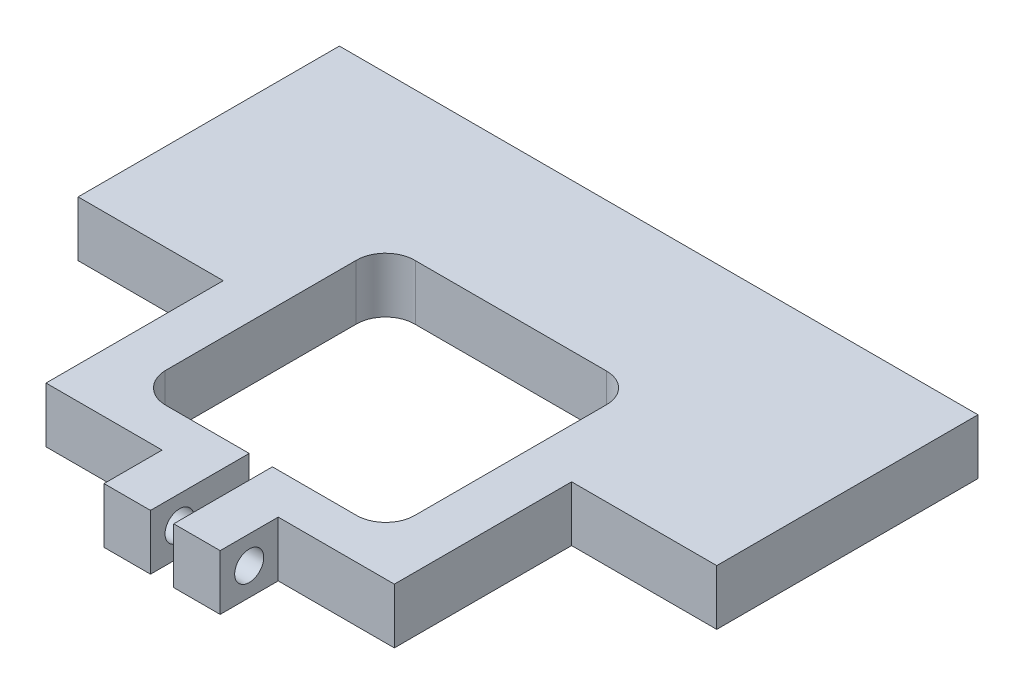
ISO-10303-21;
HEADER;
FILE_DESCRIPTION(('STEP AP214'),'2;1');
FILE_NAME('part.step','',(''),(''),'','','');
FILE_SCHEMA(('AUTOMOTIVE_DESIGN { 1 0 10303 214 1 1 1 1 }'));
ENDSEC;
DATA;
#1=APPLICATION_CONTEXT('core data for automotive mechanical design processes');
#2=APPLICATION_PROTOCOL_DEFINITION('international standard','automotive_design',2000,#1);
#3=PRODUCT_CONTEXT('',#1,'mechanical');
#4=PRODUCT('Part','Part','',(#3));
#5=PRODUCT_RELATED_PRODUCT_CATEGORY('part','',(#4));
#6=PRODUCT_DEFINITION_FORMATION('','',#4);
#7=PRODUCT_DEFINITION_CONTEXT('part definition',#1,'design');
#8=PRODUCT_DEFINITION('design','',#6,#7);
#9=PRODUCT_DEFINITION_SHAPE('','',#8);
#10=(LENGTH_UNIT() NAMED_UNIT(*) SI_UNIT(.MILLI.,.METRE.));
#11=(NAMED_UNIT(*) PLANE_ANGLE_UNIT() SI_UNIT($,.RADIAN.));
#12=(NAMED_UNIT(*) SI_UNIT($,.STERADIAN.) SOLID_ANGLE_UNIT());
#13=UNCERTAINTY_MEASURE_WITH_UNIT(LENGTH_MEASURE(1.E-05),#10,'distance_accuracy_value','');
#14=(GEOMETRIC_REPRESENTATION_CONTEXT(3) GLOBAL_UNCERTAINTY_ASSIGNED_CONTEXT((#13)) GLOBAL_UNIT_ASSIGNED_CONTEXT((#10,
#11,#12)) REPRESENTATION_CONTEXT('',''));
#15=CARTESIAN_POINT('',(0.,0.,0.));
#16=DIRECTION('',(0.,0.,1.));
#17=DIRECTION('',(1.,0.,0.));
#18=AXIS2_PLACEMENT_3D('',#15,#16,#17);
#19=CARTESIAN_POINT('',(16.51124597124,0.,21.57249194248));
#20=DIRECTION('',(0.,0.,1.));
#21=DIRECTION('',(1.,0.,0.));
#22=AXIS2_PLACEMENT_3D('',#19,#20,#21);
#23=PLANE('',#22);
#24=DIRECTION('',(1.,0.,0.));
#25=VECTOR('',#24,1.);
#26=CARTESIAN_POINT('',(16.51124597124,9.52,21.57249194248));
#27=LINE('',#26,#25);
#28=CARTESIAN_POINT('',(-16.4933123255932,9.52,21.57249194248));
#29=VERTEX_POINT('',#28);
#30=CARTESIAN_POINT('',(-2.,9.52,21.57249194248));
#31=VERTEX_POINT('',#30);
#32=EDGE_CURVE('E399',#29,#31,#27,.T.);
#33=ORIENTED_EDGE('',*,*,#32,.T.);
#34=DIRECTION('',(0.,1.,0.));
#35=VECTOR('',#34,1.);
#36=CARTESIAN_POINT('',(-2.,0.,21.57249194248));
#37=LINE('',#36,#35);
#38=CARTESIAN_POINT('',(-2.,0.,21.57249194248));
#39=VERTEX_POINT('',#38);
#40=EDGE_CURVE('E327',#39,#31,#37,.T.);
#41=ORIENTED_EDGE('',*,*,#40,.F.);
#42=DIRECTION('',(1.,0.,0.));
#43=VECTOR('',#42,1.);
#44=CARTESIAN_POINT('',(16.51124597124,0.,21.57249194248));
#45=LINE('',#44,#43);
#46=CARTESIAN_POINT('',(-16.4933123255932,0.,21.57249194248));
#47=VERTEX_POINT('',#46);
#48=EDGE_CURVE('E389',#47,#39,#45,.T.);
#49=ORIENTED_EDGE('',*,*,#48,.F.);
#50=DIRECTION('',(0.,1.,0.));
#51=VECTOR('',#50,1.);
#52=CARTESIAN_POINT('',(-16.4933123255932,0.,21.57249194248));
#53=LINE('',#52,#51);
#54=EDGE_CURVE('E262',#47,#29,#53,.T.);
#55=ORIENTED_EDGE('',*,*,#54,.T.);
#56=EDGE_LOOP('',(#33,#41,#49,#55));
#57=FACE_BOUND('',#56,.T.);
#58=ADVANCED_FACE('F33',(#57),#23,.F.);
#59=CARTESIAN_POINT('',(-10.,0.,38.57249194248));
#60=DIRECTION('',(0.,0.,1.));
#61=DIRECTION('',(1.,0.,0.));
#62=AXIS2_PLACEMENT_3D('',#59,#60,#61);
#63=PLANE('',#62);
#64=DIRECTION('',(0.,1.,0.));
#65=VECTOR('',#64,1.);
#66=CARTESIAN_POINT('',(-2.,0.,38.57249194248));
#67=LINE('',#66,#65);
#68=CARTESIAN_POINT('',(-2.,0.,38.57249194248));
#69=VERTEX_POINT('',#68);
#70=CARTESIAN_POINT('',(-2.,9.52,38.57249194248));
#71=VERTEX_POINT('',#70);
#72=EDGE_CURVE('E324',#69,#71,#67,.T.);
#73=ORIENTED_EDGE('',*,*,#72,.T.);
#74=DIRECTION('',(1.,0.,0.));
#75=VECTOR('',#74,1.);
#76=CARTESIAN_POINT('',(-10.,9.52,38.57249194248));
#77=LINE('',#76,#75);
#78=CARTESIAN_POINT('',(-10.,9.52,38.57249194248));
#79=VERTEX_POINT('',#78);
#80=EDGE_CURVE('E361',#79,#71,#77,.T.);
#81=ORIENTED_EDGE('',*,*,#80,.F.);
#82=DIRECTION('',(0.,1.,0.));
#83=VECTOR('',#82,1.);
#84=CARTESIAN_POINT('',(-10.,0.,38.57249194248));
#85=LINE('',#84,#83);
#86=CARTESIAN_POINT('',(-10.,0.,38.57249194248));
#87=VERTEX_POINT('',#86);
#88=EDGE_CURVE('E378',#87,#79,#85,.T.);
#89=ORIENTED_EDGE('',*,*,#88,.F.);
#90=DIRECTION('',(1.,0.,0.));
#91=VECTOR('',#90,1.);
#92=CARTESIAN_POINT('',(-10.,0.,38.57249194248));
#93=LINE('',#92,#91);
#94=EDGE_CURVE('E345',#87,#69,#93,.T.);
#95=ORIENTED_EDGE('',*,*,#94,.T.);
#96=EDGE_LOOP('',(#73,#81,#89,#95));
#97=FACE_BOUND('',#96,.T.);
#98=ADVANCED_FACE('F442',(#97),#63,.T.);
#99=CARTESIAN_POINT('',(-30.,9.52,-25.));
#100=DIRECTION('',(1.,0.,0.));
#101=DIRECTION('',(0.,0.,-1.));
#102=AXIS2_PLACEMENT_3D('',#99,#100,#101);
#103=PLANE('',#102);
#104=DIRECTION('',(0.,0.,1.));
#105=VECTOR('',#104,1.);
#106=CARTESIAN_POINT('',(-30.,9.52,-25.));
#107=LINE('',#106,#105);
#108=CARTESIAN_POINT('',(-30.,9.52,-1.95999999999999));
#109=VERTEX_POINT('',#108);
#110=CARTESIAN_POINT('',(-30.,9.52,28.57249194248));
#111=VERTEX_POINT('',#110);
#112=EDGE_CURVE('E411',#109,#111,#107,.T.);
#113=ORIENTED_EDGE('',*,*,#112,.F.);
#114=DIRECTION('',(0.,-1.,0.));
#115=VECTOR('',#114,1.);
#116=CARTESIAN_POINT('',(-30.,9.52,-1.95999999999999));
#117=LINE('',#116,#115);
#118=CARTESIAN_POINT('',(-30.,0.,-1.95999999999999));
#119=VERTEX_POINT('',#118);
#120=EDGE_CURVE('E299',#109,#119,#117,.T.);
#121=ORIENTED_EDGE('',*,*,#120,.T.);
#122=DIRECTION('',(0.,0.,1.));
#123=VECTOR('',#122,1.);
#124=CARTESIAN_POINT('',(-30.,0.,-25.));
#125=LINE('',#124,#123);
#126=CARTESIAN_POINT('',(-30.,0.,28.57249194248));
#127=VERTEX_POINT('',#126);
#128=EDGE_CURVE('E408',#119,#127,#125,.T.);
#129=ORIENTED_EDGE('',*,*,#128,.T.);
#130=DIRECTION('',(0.,1.,0.));
#131=VECTOR('',#130,1.);
#132=CARTESIAN_POINT('',(-30.,0.,28.57249194248));
#133=LINE('',#132,#131);
#134=EDGE_CURVE('E354',#127,#111,#133,.T.);
#135=ORIENTED_EDGE('',*,*,#134,.T.);
#136=EDGE_LOOP('',(#113,#121,#129,#135));
#137=FACE_BOUND('',#136,.T.);
#138=ADVANCED_FACE('F35',(#137),#103,.F.);
#139=CARTESIAN_POINT('',(30.,9.52,-25.));
#140=DIRECTION('',(-1.,0.,0.));
#141=DIRECTION('',(0.,0.,1.));
#142=AXIS2_PLACEMENT_3D('',#139,#140,#141);
#143=PLANE('',#142);
#144=DIRECTION('',(0.,0.,-1.));
#145=VECTOR('',#144,1.);
#146=CARTESIAN_POINT('',(30.,0.,-25.));
#147=LINE('',#146,#145);
#148=CARTESIAN_POINT('',(30.,0.,28.57249194248));
#149=VERTEX_POINT('',#148);
#150=CARTESIAN_POINT('',(30.,0.,-1.95999999999999));
#151=VERTEX_POINT('',#150);
#152=EDGE_CURVE('E414',#149,#151,#147,.T.);
#153=ORIENTED_EDGE('',*,*,#152,.T.);
#154=DIRECTION('',(0.,1.,0.));
#155=VECTOR('',#154,1.);
#156=CARTESIAN_POINT('',(30.,9.52,-1.95999999999999));
#157=LINE('',#156,#155);
#158=CARTESIAN_POINT('',(30.,9.52,-1.95999999999999));
#159=VERTEX_POINT('',#158);
#160=EDGE_CURVE('E289',#151,#159,#157,.T.);
#161=ORIENTED_EDGE('',*,*,#160,.T.);
#162=DIRECTION('',(0.,0.,-1.));
#163=VECTOR('',#162,1.);
#164=CARTESIAN_POINT('',(30.,9.52,-25.));
#165=LINE('',#164,#163);
#166=CARTESIAN_POINT('',(30.,9.52,28.57249194248));
#167=VERTEX_POINT('',#166);
#168=EDGE_CURVE('E413',#167,#159,#165,.T.);
#169=ORIENTED_EDGE('',*,*,#168,.F.);
#170=DIRECTION('',(0.,1.,0.));
#171=VECTOR('',#170,1.);
#172=CARTESIAN_POINT('',(30.,0.,28.57249194248));
#173=LINE('',#172,#171);
#174=EDGE_CURVE('E369',#149,#167,#173,.T.);
#175=ORIENTED_EDGE('',*,*,#174,.F.);
#176=EDGE_LOOP('',(#153,#161,#169,#175));
#177=FACE_BOUND('',#176,.T.);
#178=ADVANCED_FACE('F474',(#177),#143,.F.);
#179=CARTESIAN_POINT('',(-30.,9.52,25.));
#180=DIRECTION('',(0.,1.,0.));
#181=DIRECTION('',(0.,0.,1.));
#182=AXIS2_PLACEMENT_3D('',#179,#180,#181);
#183=PLANE('',#182);
#184=ORIENTED_EDGE('',*,*,#32,.F.);
#185=CARTESIAN_POINT('',(-16.2814720498575,9.52,16.2666853638085));
#186=DIRECTION('',(0.,1.,0.));
#187=DIRECTION('',(0.,0.,1.));
#188=AXIS2_PLACEMENT_3D('',#185,#186,#187);
#189=CIRCLE('',#188,5.31003387491053);
#190=CARTESIAN_POINT('',(-16.5518484811159,9.52,21.5698312545151));
#191=VERTEX_POINT('',#190);
#192=EDGE_CURVE('E237',#191,#29,#189,.T.);
#193=ORIENTED_EDGE('',*,*,#192,.F.);
#194=CARTESIAN_POINT('',(-16.38875402876,9.52,16.57249194248));
#195=DIRECTION('',(0.,1.,0.));
#196=DIRECTION('',(0.,0.,1.));
#197=AXIS2_PLACEMENT_3D('',#194,#195,#196);
#198=CIRCLE('',#197,5.);
#199=CARTESIAN_POINT('',(-19.3834641479962,9.52,20.5764538930665));
#200=VERTEX_POINT('',#199);
#201=EDGE_CURVE('E372',#200,#191,#198,.T.);
#202=ORIENTED_EDGE('',*,*,#201,.F.);
#203=CARTESIAN_POINT('',(-21.5874689171889,9.52,16.4737046782845));
#204=VERTEX_POINT('',#203);
#205=EDGE_CURVE('E235',#204,#200,#189,.T.);
#206=ORIENTED_EDGE('',*,*,#205,.F.);
#207=DIRECTION('',(0.,0.,1.));
#208=VECTOR('',#207,1.);
#209=CARTESIAN_POINT('',(-21.5874689171889,9.52,16.4737046782845));
#210=LINE('',#209,#208);
#211=CARTESIAN_POINT('',(-21.5874689171889,9.52,-16.4262953217155));
#212=VERTEX_POINT('',#211);
#213=EDGE_CURVE('E256',#212,#204,#210,.T.);
#214=ORIENTED_EDGE('',*,*,#213,.F.);
#215=CARTESIAN_POINT('',(-16.5879942437893,9.52,-16.4987728357185));
#216=DIRECTION('',(0.,1.,0.));
#217=DIRECTION('',(0.,0.,1.));
#218=AXIS2_PLACEMENT_3D('',#215,#216,#217);
#219=CIRCLE('',#218,5.);
#220=CARTESIAN_POINT('',(-16.4304615993331,9.52,-21.4962905661454));
#221=VERTEX_POINT('',#220);
#222=EDGE_CURVE('E253',#221,#212,#219,.T.);
#223=ORIENTED_EDGE('',*,*,#222,.F.);
#224=DIRECTION('',(-1.,0.,0.));
#225=VECTOR('',#224,1.);
#226=CARTESIAN_POINT('',(-16.4304615993331,9.52,-21.4962905661454));
#227=LINE('',#226,#225);
#228=CARTESIAN_POINT('',(16.4695384006668,9.52,-21.4962905661454));
#229=VERTEX_POINT('',#228);
#230=EDGE_CURVE('E250',#229,#221,#227,.T.);
#231=ORIENTED_EDGE('',*,*,#230,.F.);
#232=CARTESIAN_POINT('',(16.4755108139809,9.52,-16.4605479036767));
#233=DIRECTION('',(0.,1.,0.));
#234=DIRECTION('',(0.,0.,1.));
#235=AXIS2_PLACEMENT_3D('',#232,#233,#234);
#236=CIRCLE('',#235,5.03574620412182);
#237=CARTESIAN_POINT('',(21.51124597124,9.52,-16.45));
#238=VERTEX_POINT('',#237);
#239=EDGE_CURVE('E215',#238,#229,#236,.T.);
#240=ORIENTED_EDGE('',*,*,#239,.F.);
#241=DIRECTION('',(0.,0.,-1.));
#242=VECTOR('',#241,1.);
#243=CARTESIAN_POINT('',(21.51124597124,9.52,-16.3275080575199));
#244=LINE('',#243,#242);
#245=CARTESIAN_POINT('',(21.51124597124,9.52,16.57249194248));
#246=VERTEX_POINT('',#245);
#247=EDGE_CURVE('E388',#246,#238,#244,.T.);
#248=ORIENTED_EDGE('',*,*,#247,.F.);
#249=CARTESIAN_POINT('',(16.51124597124,9.52,16.57249194248));
#250=DIRECTION('',(0.,1.,0.));
#251=DIRECTION('',(0.,0.,1.));
#252=AXIS2_PLACEMENT_3D('',#249,#250,#251);
#253=CIRCLE('',#252,5.);
#254=CARTESIAN_POINT('',(16.51124597124,9.52,21.57249194248));
#255=VERTEX_POINT('',#254);
#256=EDGE_CURVE('E402',#255,#246,#253,.T.);
#257=ORIENTED_EDGE('',*,*,#256,.F.);
#258=CARTESIAN_POINT('',(2.,9.52,21.57249194248));
#259=VERTEX_POINT('',#258);
#260=EDGE_CURVE('E398',#259,#255,#27,.T.);
#261=ORIENTED_EDGE('',*,*,#260,.F.);
#262=DIRECTION('',(0.,0.,-1.));
#263=VECTOR('',#262,1.);
#264=CARTESIAN_POINT('',(2.,9.52,21.57249194248));
#265=LINE('',#264,#263);
#266=CARTESIAN_POINT('',(2.00000000000001,9.52,38.57249194248));
#267=VERTEX_POINT('',#266);
#268=EDGE_CURVE('E321',#267,#259,#265,.T.);
#269=ORIENTED_EDGE('',*,*,#268,.F.);
#270=CARTESIAN_POINT('',(10.,9.52,38.57249194248));
#271=VERTEX_POINT('',#270);
#272=EDGE_CURVE('E360',#267,#271,#77,.T.);
#273=ORIENTED_EDGE('',*,*,#272,.T.);
#274=DIRECTION('',(0.,0.,-1.));
#275=VECTOR('',#274,1.);
#276=CARTESIAN_POINT('',(10.,9.52,28.57249194248));
#277=LINE('',#276,#275);
#278=CARTESIAN_POINT('',(10.,9.52,28.57249194248));
#279=VERTEX_POINT('',#278);
#280=EDGE_CURVE('E364',#271,#279,#277,.T.);
#281=ORIENTED_EDGE('',*,*,#280,.T.);
#282=DIRECTION('',(1.,0.,0.));
#283=VECTOR('',#282,1.);
#284=CARTESIAN_POINT('',(30.,9.52,28.57249194248));
#285=LINE('',#284,#283);
#286=EDGE_CURVE('E341',#279,#167,#285,.T.);
#287=ORIENTED_EDGE('',*,*,#286,.T.);
#288=ORIENTED_EDGE('',*,*,#168,.T.);
#289=DIRECTION('',(1.,0.,0.));
#290=VECTOR('',#289,1.);
#291=CARTESIAN_POINT('',(-55.,9.52,-1.95999999999999));
#292=LINE('',#291,#290);
#293=CARTESIAN_POINT('',(55.,9.52,-1.95999999999999));
#294=VERTEX_POINT('',#293);
#295=EDGE_CURVE('E282',#159,#294,#292,.T.);
#296=ORIENTED_EDGE('',*,*,#295,.T.);
#297=DIRECTION('',(0.,0.,-1.));
#298=VECTOR('',#297,1.);
#299=CARTESIAN_POINT('',(55.,9.52,-46.96));
#300=LINE('',#299,#298);
#301=CARTESIAN_POINT('',(55.,9.52,-46.96));
#302=VERTEX_POINT('',#301);
#303=EDGE_CURVE('E274',#294,#302,#300,.T.);
#304=ORIENTED_EDGE('',*,*,#303,.T.);
#305=DIRECTION('',(-1.,0.,0.));
#306=VECTOR('',#305,1.);
#307=CARTESIAN_POINT('',(30.,9.52,-46.96));
#308=LINE('',#307,#306);
#309=CARTESIAN_POINT('',(-55.,9.52,-46.96));
#310=VERTEX_POINT('',#309);
#311=EDGE_CURVE('E302',#302,#310,#308,.T.);
#312=ORIENTED_EDGE('',*,*,#311,.T.);
#313=DIRECTION('',(0.,0.,1.));
#314=VECTOR('',#313,1.);
#315=CARTESIAN_POINT('',(-55.,9.52,-46.96));
#316=LINE('',#315,#314);
#317=CARTESIAN_POINT('',(-55.,9.52,-1.95999999999999));
#318=VERTEX_POINT('',#317);
#319=EDGE_CURVE('E261',#310,#318,#316,.T.);
#320=ORIENTED_EDGE('',*,*,#319,.T.);
#321=EDGE_CURVE('E56',#318,#109,#292,.T.);
#322=ORIENTED_EDGE('',*,*,#321,.T.);
#323=ORIENTED_EDGE('',*,*,#112,.T.);
#324=DIRECTION('',(1.,0.,0.));
#325=VECTOR('',#324,1.);
#326=CARTESIAN_POINT('',(-10.,9.52,28.57249194248));
#327=LINE('',#326,#325);
#328=CARTESIAN_POINT('',(-10.,9.52,28.57249194248));
#329=VERTEX_POINT('',#328);
#330=EDGE_CURVE('E329',#111,#329,#327,.T.);
#331=ORIENTED_EDGE('',*,*,#330,.T.);
#332=DIRECTION('',(0.,0.,1.));
#333=VECTOR('',#332,1.);
#334=CARTESIAN_POINT('',(-10.,9.52,28.57249194248));
#335=LINE('',#334,#333);
#336=EDGE_CURVE('E357',#329,#79,#335,.T.);
#337=ORIENTED_EDGE('',*,*,#336,.T.);
#338=ORIENTED_EDGE('',*,*,#80,.T.);
#339=DIRECTION('',(0.,0.,1.));
#340=VECTOR('',#339,1.);
#341=CARTESIAN_POINT('',(-2.,9.52,21.57249194248));
#342=LINE('',#341,#340);
#343=EDGE_CURVE('E316',#31,#71,#342,.T.);
#344=ORIENTED_EDGE('',*,*,#343,.F.);
#345=EDGE_LOOP('',(#184,#193,#202,#206,#214,#223,#231,#240,#248,#257,#261,#269,#273,#281,#287,
#288,#296,#304,#312,#320,#322,#323,#331,#337,#338,#344));
#346=FACE_BOUND('',#345,.T.);
#347=ADVANCED_FACE('F432',(#346),#183,.T.);
#348=CARTESIAN_POINT('',(-30.,0.,25.));
#349=DIRECTION('',(0.,1.,0.));
#350=DIRECTION('',(0.,0.,1.));
#351=AXIS2_PLACEMENT_3D('',#348,#349,#350);
#352=PLANE('',#351);
#353=CARTESIAN_POINT('',(-16.2814720498575,0.,16.2666853638085));
#354=DIRECTION('',(0.,1.,0.));
#355=DIRECTION('',(0.,0.,1.));
#356=AXIS2_PLACEMENT_3D('',#353,#354,#355);
#357=CIRCLE('',#356,5.31003387491053);
#358=CARTESIAN_POINT('',(-16.5518484811159,0.,21.5698312545151));
#359=VERTEX_POINT('',#358);
#360=EDGE_CURVE('E48',#359,#47,#357,.T.);
#361=ORIENTED_EDGE('',*,*,#360,.T.);
#362=ORIENTED_EDGE('',*,*,#48,.T.);
#363=DIRECTION('',(0.,0.,1.));
#364=VECTOR('',#363,1.);
#365=CARTESIAN_POINT('',(-2.,0.,21.57249194248));
#366=LINE('',#365,#364);
#367=EDGE_CURVE('E317',#39,#69,#366,.T.);
#368=ORIENTED_EDGE('',*,*,#367,.T.);
#369=ORIENTED_EDGE('',*,*,#94,.F.);
#370=DIRECTION('',(0.,0.,1.));
#371=VECTOR('',#370,1.);
#372=CARTESIAN_POINT('',(-10.,0.,28.57249194248));
#373=LINE('',#372,#371);
#374=CARTESIAN_POINT('',(-10.,0.,28.57249194248));
#375=VERTEX_POINT('',#374);
#376=EDGE_CURVE('E340',#375,#87,#373,.T.);
#377=ORIENTED_EDGE('',*,*,#376,.F.);
#378=DIRECTION('',(1.,0.,0.));
#379=VECTOR('',#378,1.);
#380=CARTESIAN_POINT('',(-10.,0.,28.57249194248));
#381=LINE('',#380,#379);
#382=EDGE_CURVE('E337',#127,#375,#381,.T.);
#383=ORIENTED_EDGE('',*,*,#382,.F.);
#384=ORIENTED_EDGE('',*,*,#128,.F.);
#385=DIRECTION('',(1.,0.,0.));
#386=VECTOR('',#385,1.);
#387=CARTESIAN_POINT('',(-55.,0.,-1.95999999999999));
#388=LINE('',#387,#386);
#389=CARTESIAN_POINT('',(-55.,0.,-1.95999999999999));
#390=VERTEX_POINT('',#389);
#391=EDGE_CURVE('E275',#390,#119,#388,.T.);
#392=ORIENTED_EDGE('',*,*,#391,.F.);
#393=DIRECTION('',(0.,0.,1.));
#394=VECTOR('',#393,1.);
#395=CARTESIAN_POINT('',(-55.,0.,-46.96));
#396=LINE('',#395,#394);
#397=CARTESIAN_POINT('',(-55.,0.,-46.96));
#398=VERTEX_POINT('',#397);
#399=EDGE_CURVE('E270',#398,#390,#396,.T.);
#400=ORIENTED_EDGE('',*,*,#399,.F.);
#401=DIRECTION('',(-1.,0.,0.));
#402=VECTOR('',#401,1.);
#403=CARTESIAN_POINT('',(30.,0.,-46.96));
#404=LINE('',#403,#402);
#405=CARTESIAN_POINT('',(55.,0.,-46.96));
#406=VERTEX_POINT('',#405);
#407=EDGE_CURVE('E303',#406,#398,#404,.T.);
#408=ORIENTED_EDGE('',*,*,#407,.F.);
#409=DIRECTION('',(0.,0.,-1.));
#410=VECTOR('',#409,1.);
#411=CARTESIAN_POINT('',(55.,0.,-46.96));
#412=LINE('',#411,#410);
#413=CARTESIAN_POINT('',(55.,0.,-1.95999999999999));
#414=VERTEX_POINT('',#413);
#415=EDGE_CURVE('E277',#414,#406,#412,.T.);
#416=ORIENTED_EDGE('',*,*,#415,.F.);
#417=EDGE_CURVE('E273',#151,#414,#388,.T.);
#418=ORIENTED_EDGE('',*,*,#417,.F.);
#419=ORIENTED_EDGE('',*,*,#152,.F.);
#420=DIRECTION('',(1.,0.,0.));
#421=VECTOR('',#420,1.);
#422=CARTESIAN_POINT('',(30.,0.,28.57249194248));
#423=LINE('',#422,#421);
#424=CARTESIAN_POINT('',(10.,0.,28.57249194248));
#425=VERTEX_POINT('',#424);
#426=EDGE_CURVE('E351',#425,#149,#423,.T.);
#427=ORIENTED_EDGE('',*,*,#426,.F.);
#428=DIRECTION('',(0.,0.,-1.));
#429=VECTOR('',#428,1.);
#430=CARTESIAN_POINT('',(10.,0.,28.57249194248));
#431=LINE('',#430,#429);
#432=CARTESIAN_POINT('',(10.,0.,38.57249194248));
#433=VERTEX_POINT('',#432);
#434=EDGE_CURVE('E348',#433,#425,#431,.T.);
#435=ORIENTED_EDGE('',*,*,#434,.F.);
#436=CARTESIAN_POINT('',(2.00000000000001,0.,38.57249194248));
#437=VERTEX_POINT('',#436);
#438=EDGE_CURVE('E344',#437,#433,#93,.T.);
#439=ORIENTED_EDGE('',*,*,#438,.F.);
#440=DIRECTION('',(0.,0.,-1.));
#441=VECTOR('',#440,1.);
#442=CARTESIAN_POINT('',(2.,0.,21.57249194248));
#443=LINE('',#442,#441);
#444=CARTESIAN_POINT('',(2.,0.,21.57249194248));
#445=VERTEX_POINT('',#444);
#446=EDGE_CURVE('E320',#437,#445,#443,.T.);
#447=ORIENTED_EDGE('',*,*,#446,.T.);
#448=CARTESIAN_POINT('',(16.51124597124,0.,21.57249194248));
#449=VERTEX_POINT('',#448);
#450=EDGE_CURVE('E387',#445,#449,#45,.T.);
#451=ORIENTED_EDGE('',*,*,#450,.T.);
#452=CARTESIAN_POINT('',(16.51124597124,0.,16.57249194248));
#453=DIRECTION('',(0.,1.,0.));
#454=DIRECTION('',(0.,0.,1.));
#455=AXIS2_PLACEMENT_3D('',#452,#453,#454);
#456=CIRCLE('',#455,5.);
#457=CARTESIAN_POINT('',(21.51124597124,0.,16.57249194248));
#458=VERTEX_POINT('',#457);
#459=EDGE_CURVE('E392',#449,#458,#456,.T.);
#460=ORIENTED_EDGE('',*,*,#459,.T.);
#461=DIRECTION('',(0.,0.,-1.));
#462=VECTOR('',#461,1.);
#463=CARTESIAN_POINT('',(21.51124597124,0.,-16.3275080575199));
#464=LINE('',#463,#462);
#465=CARTESIAN_POINT('',(21.51124597124,0.,-16.45));
#466=VERTEX_POINT('',#465);
#467=EDGE_CURVE('E233',#458,#466,#464,.T.);
#468=ORIENTED_EDGE('',*,*,#467,.T.);
#469=CARTESIAN_POINT('',(16.4755108139809,0.,-16.4605479036767));
#470=DIRECTION('',(0.,1.,0.));
#471=DIRECTION('',(0.,0.,1.));
#472=AXIS2_PLACEMENT_3D('',#469,#470,#471);
#473=CIRCLE('',#472,5.03574620412182);
#474=CARTESIAN_POINT('',(16.4695384006668,0.,-21.4962905661454));
#475=VERTEX_POINT('',#474);
#476=EDGE_CURVE('E213',#466,#475,#473,.T.);
#477=ORIENTED_EDGE('',*,*,#476,.T.);
#478=DIRECTION('',(-1.,0.,0.));
#479=VECTOR('',#478,1.);
#480=CARTESIAN_POINT('',(-16.4304615993331,0.,-21.4962905661454));
#481=LINE('',#480,#479);
#482=CARTESIAN_POINT('',(-16.4304615993331,0.,-21.4962905661454));
#483=VERTEX_POINT('',#482);
#484=EDGE_CURVE('E223',#475,#483,#481,.T.);
#485=ORIENTED_EDGE('',*,*,#484,.T.);
#486=CARTESIAN_POINT('',(-16.5879942437893,0.,-16.4987728357185));
#487=DIRECTION('',(0.,1.,0.));
#488=DIRECTION('',(0.,0.,1.));
#489=AXIS2_PLACEMENT_3D('',#486,#487,#488);
#490=CIRCLE('',#489,5.);
#491=CARTESIAN_POINT('',(-21.5874689171889,0.,-16.4262953217155));
#492=VERTEX_POINT('',#491);
#493=EDGE_CURVE('E228',#483,#492,#490,.T.);
#494=ORIENTED_EDGE('',*,*,#493,.T.);
#495=DIRECTION('',(0.,0.,1.));
#496=VECTOR('',#495,1.);
#497=CARTESIAN_POINT('',(-21.5874689171889,0.,16.4737046782845));
#498=LINE('',#497,#496);
#499=CARTESIAN_POINT('',(-21.5874689171889,0.,16.4737046782845));
#500=VERTEX_POINT('',#499);
#501=EDGE_CURVE('E244',#492,#500,#498,.T.);
#502=ORIENTED_EDGE('',*,*,#501,.T.);
#503=CARTESIAN_POINT('',(-19.3834641479962,0.,20.5764538930665));
#504=VERTEX_POINT('',#503);
#505=EDGE_CURVE('E220',#500,#504,#357,.T.);
#506=ORIENTED_EDGE('',*,*,#505,.T.);
#507=CARTESIAN_POINT('',(-16.38875402876,0.,16.57249194248));
#508=DIRECTION('',(0.,1.,0.));
#509=DIRECTION('',(0.,0.,1.));
#510=AXIS2_PLACEMENT_3D('',#507,#508,#509);
#511=CIRCLE('',#510,5.);
#512=EDGE_CURVE('E384',#504,#359,#511,.T.);
#513=ORIENTED_EDGE('',*,*,#512,.T.);
#514=EDGE_LOOP('',(#361,#362,#368,#369,#377,#383,#384,#392,#400,#408,#416,#418,#419,#427,#435,
#439,#447,#451,#460,#468,#477,#485,#494,#502,#506,#513));
#515=FACE_BOUND('',#514,.T.);
#516=ADVANCED_FACE('F230',(#515),#352,.F.);
#517=CARTESIAN_POINT('',(21.51124597124,0.,-16.3275080575199));
#518=DIRECTION('',(1.,0.,0.));
#519=DIRECTION('',(0.,0.,-1.));
#520=AXIS2_PLACEMENT_3D('',#517,#518,#519);
#521=PLANE('',#520);
#522=ORIENTED_EDGE('',*,*,#247,.T.);
#523=DIRECTION('',(0.,1.,0.));
#524=VECTOR('',#523,1.);
#525=CARTESIAN_POINT('',(21.51124597124,0.,-16.45));
#526=LINE('',#525,#524);
#527=EDGE_CURVE('E259',#466,#238,#526,.T.);
#528=ORIENTED_EDGE('',*,*,#527,.F.);
#529=ORIENTED_EDGE('',*,*,#467,.F.);
#530=DIRECTION('',(0.,1.,0.));
#531=VECTOR('',#530,1.);
#532=CARTESIAN_POINT('',(21.51124597124,0.,16.57249194248));
#533=LINE('',#532,#531);
#534=EDGE_CURVE('E406',#458,#246,#533,.T.);
#535=ORIENTED_EDGE('',*,*,#534,.T.);
#536=EDGE_LOOP('',(#522,#528,#529,#535));
#537=FACE_BOUND('',#536,.T.);
#538=ADVANCED_FACE('F504',(#537),#521,.F.);
#539=CARTESIAN_POINT('',(16.51124597124,0.,16.57249194248));
#540=DIRECTION('',(0.,1.,0.));
#541=DIRECTION('',(0.,0.,1.));
#542=AXIS2_PLACEMENT_3D('',#539,#540,#541);
#543=CYLINDRICAL_SURFACE('',#542,5.);
#544=ORIENTED_EDGE('',*,*,#256,.T.);
#545=ORIENTED_EDGE('',*,*,#534,.F.);
#546=ORIENTED_EDGE('',*,*,#459,.F.);
#547=DIRECTION('',(0.,1.,0.));
#548=VECTOR('',#547,1.);
#549=CARTESIAN_POINT('',(16.51124597124,0.,21.57249194248));
#550=LINE('',#549,#548);
#551=EDGE_CURVE('E395',#449,#255,#550,.T.);
#552=ORIENTED_EDGE('',*,*,#551,.T.);
#553=EDGE_LOOP('',(#544,#545,#546,#552));
#554=FACE_BOUND('',#553,.T.);
#555=ADVANCED_FACE('F502',(#554),#543,.F.);
#556=ORIENTED_EDGE('',*,*,#551,.F.);
#557=ORIENTED_EDGE('',*,*,#450,.F.);
#558=DIRECTION('',(0.,1.,0.));
#559=VECTOR('',#558,1.);
#560=CARTESIAN_POINT('',(2.,0.,21.57249194248));
#561=LINE('',#560,#559);
#562=EDGE_CURVE('E330',#445,#259,#561,.T.);
#563=ORIENTED_EDGE('',*,*,#562,.T.);
#564=ORIENTED_EDGE('',*,*,#260,.T.);
#565=EDGE_LOOP('',(#556,#557,#563,#564));
#566=FACE_BOUND('',#565,.T.);
#567=ADVANCED_FACE('F498',(#566),#23,.F.);
#568=CARTESIAN_POINT('',(-16.38875402876,0.,16.57249194248));
#569=DIRECTION('',(0.,1.,0.));
#570=DIRECTION('',(0.,0.,1.));
#571=AXIS2_PLACEMENT_3D('',#568,#569,#570);
#572=CYLINDRICAL_SURFACE('',#571,5.);
#573=ORIENTED_EDGE('',*,*,#512,.F.);
#574=DIRECTION('',(0.,1.,0.));
#575=VECTOR('',#574,1.);
#576=CARTESIAN_POINT('',(-19.3834641479962,4.76,20.5764538930665));
#577=LINE('',#576,#575);
#578=EDGE_CURVE('E11',#504,#200,#577,.T.);
#579=ORIENTED_EDGE('',*,*,#578,.T.);
#580=ORIENTED_EDGE('',*,*,#201,.T.);
#581=DIRECTION('',(0.,1.,0.));
#582=VECTOR('',#581,1.);
#583=CARTESIAN_POINT('',(-16.5518484811159,4.76,21.5698312545151));
#584=LINE('',#583,#582);
#585=EDGE_CURVE('E41',#191,#359,#584,.F.);
#586=ORIENTED_EDGE('',*,*,#585,.T.);
#587=EDGE_LOOP('',(#573,#579,#580,#586));
#588=FACE_BOUND('',#587,.T.);
#589=ADVANCED_FACE('F423',(#588),#572,.F.);
#590=CARTESIAN_POINT('',(30.,0.,28.57249194248));
#591=DIRECTION('',(0.,0.,1.));
#592=DIRECTION('',(1.,0.,0.));
#593=AXIS2_PLACEMENT_3D('',#590,#591,#592);
#594=PLANE('',#593);
#595=ORIENTED_EDGE('',*,*,#286,.F.);
#596=DIRECTION('',(0.,1.,0.));
#597=VECTOR('',#596,1.);
#598=CARTESIAN_POINT('',(10.,0.,28.57249194248));
#599=LINE('',#598,#597);
#600=EDGE_CURVE('E373',#425,#279,#599,.T.);
#601=ORIENTED_EDGE('',*,*,#600,.F.);
#602=ORIENTED_EDGE('',*,*,#426,.T.);
#603=ORIENTED_EDGE('',*,*,#174,.T.);
#604=EDGE_LOOP('',(#595,#601,#602,#603));
#605=FACE_BOUND('',#604,.T.);
#606=ADVANCED_FACE('F479',(#605),#594,.T.);
#607=CARTESIAN_POINT('',(10.,0.,28.57249194248));
#608=DIRECTION('',(1.,0.,0.));
#609=DIRECTION('',(0.,0.,-1.));
#610=AXIS2_PLACEMENT_3D('',#607,#608,#609);
#611=PLANE('',#610);
#612=CARTESIAN_POINT('',(10.,4.76,33.57249194248));
#613=DIRECTION('',(1.,0.,0.));
#614=DIRECTION('',(0.,0.,-1.));
#615=AXIS2_PLACEMENT_3D('',#612,#613,#614);
#616=CIRCLE('',#615,2.5);
#617=CARTESIAN_POINT('',(10.,4.76,31.07249194248));
#618=VERTEX_POINT('',#617);
#619=EDGE_CURVE('E305',#618,#618,#616,.T.);
#620=ORIENTED_EDGE('',*,*,#619,.F.);
#621=EDGE_LOOP('',(#620));
#622=FACE_BOUND('',#621,.T.);
#623=ORIENTED_EDGE('',*,*,#280,.F.);
#624=DIRECTION('',(0.,1.,0.));
#625=VECTOR('',#624,1.);
#626=CARTESIAN_POINT('',(10.,0.,38.57249194248));
#627=LINE('',#626,#625);
#628=EDGE_CURVE('E375',#433,#271,#627,.T.);
#629=ORIENTED_EDGE('',*,*,#628,.F.);
#630=ORIENTED_EDGE('',*,*,#434,.T.);
#631=ORIENTED_EDGE('',*,*,#600,.T.);
#632=EDGE_LOOP('',(#623,#629,#630,#631));
#633=FACE_BOUND('',#632,.T.);
#634=ADVANCED_FACE('F485',(#622,#633),#611,.T.);
#635=DIRECTION('',(0.,1.,0.));
#636=VECTOR('',#635,1.);
#637=CARTESIAN_POINT('',(2.00000000000001,0.,38.57249194248));
#638=LINE('',#637,#636);
#639=EDGE_CURVE('E333',#437,#267,#638,.T.);
#640=ORIENTED_EDGE('',*,*,#639,.F.);
#641=ORIENTED_EDGE('',*,*,#438,.T.);
#642=ORIENTED_EDGE('',*,*,#628,.T.);
#643=ORIENTED_EDGE('',*,*,#272,.F.);
#644=EDGE_LOOP('',(#640,#641,#642,#643));
#645=FACE_BOUND('',#644,.T.);
#646=ADVANCED_FACE('F489',(#645),#63,.T.);
#647=CARTESIAN_POINT('',(-10.,0.,28.57249194248));
#648=DIRECTION('',(-1.,0.,0.));
#649=DIRECTION('',(0.,0.,1.));
#650=AXIS2_PLACEMENT_3D('',#647,#648,#649);
#651=PLANE('',#650);
#652=CARTESIAN_POINT('',(-10.,4.76,33.57249194248));
#653=DIRECTION('',(-1.,0.,0.));
#654=DIRECTION('',(0.,0.,1.));
#655=AXIS2_PLACEMENT_3D('',#652,#653,#654);
#656=CIRCLE('',#655,2.5);
#657=CARTESIAN_POINT('',(-10.,4.76,36.07249194248));
#658=VERTEX_POINT('',#657);
#659=EDGE_CURVE('E309',#658,#658,#656,.F.);
#660=ORIENTED_EDGE('',*,*,#659,.T.);
#661=EDGE_LOOP('',(#660));
#662=FACE_BOUND('',#661,.T.);
#663=ORIENTED_EDGE('',*,*,#336,.F.);
#664=DIRECTION('',(0.,1.,0.));
#665=VECTOR('',#664,1.);
#666=CARTESIAN_POINT('',(-10.,0.,28.57249194248));
#667=LINE('',#666,#665);
#668=EDGE_CURVE('E380',#375,#329,#667,.T.);
#669=ORIENTED_EDGE('',*,*,#668,.F.);
#670=ORIENTED_EDGE('',*,*,#376,.T.);
#671=ORIENTED_EDGE('',*,*,#88,.T.);
#672=EDGE_LOOP('',(#663,#669,#670,#671));
#673=FACE_BOUND('',#672,.T.);
#674=ADVANCED_FACE('F446',(#662,#673),#651,.T.);
#675=CARTESIAN_POINT('',(-10.,0.,28.57249194248));
#676=DIRECTION('',(0.,0.,1.));
#677=DIRECTION('',(1.,0.,0.));
#678=AXIS2_PLACEMENT_3D('',#675,#676,#677);
#679=PLANE('',#678);
#680=ORIENTED_EDGE('',*,*,#330,.F.);
#681=ORIENTED_EDGE('',*,*,#134,.F.);
#682=ORIENTED_EDGE('',*,*,#382,.T.);
#683=ORIENTED_EDGE('',*,*,#668,.T.);
#684=EDGE_LOOP('',(#680,#681,#682,#683));
#685=FACE_BOUND('',#684,.T.);
#686=ADVANCED_FACE('F452',(#685),#679,.T.);
#687=CARTESIAN_POINT('',(2.,0.,21.57249194248));
#688=DIRECTION('',(1.,0.,0.));
#689=DIRECTION('',(0.,0.,-1.));
#690=AXIS2_PLACEMENT_3D('',#687,#688,#689);
#691=PLANE('',#690);
#692=CARTESIAN_POINT('',(2.00000000000001,4.76,33.57249194248));
#693=DIRECTION('',(1.,0.,0.));
#694=DIRECTION('',(0.,0.,-1.));
#695=AXIS2_PLACEMENT_3D('',#692,#693,#694);
#696=CIRCLE('',#695,2.5);
#697=CARTESIAN_POINT('',(2.,4.76,31.07249194248));
#698=VERTEX_POINT('',#697);
#699=EDGE_CURVE('E313',#698,#698,#696,.T.);
#700=ORIENTED_EDGE('',*,*,#699,.T.);
#701=EDGE_LOOP('',(#700));
#702=FACE_BOUND('',#701,.T.);
#703=ORIENTED_EDGE('',*,*,#268,.T.);
#704=ORIENTED_EDGE('',*,*,#562,.F.);
#705=ORIENTED_EDGE('',*,*,#446,.F.);
#706=ORIENTED_EDGE('',*,*,#639,.T.);
#707=EDGE_LOOP('',(#703,#704,#705,#706));
#708=FACE_BOUND('',#707,.T.);
#709=ADVANCED_FACE('F492',(#702,#708),#691,.F.);
#710=CARTESIAN_POINT('',(-2.,0.,21.57249194248));
#711=DIRECTION('',(-1.,0.,0.));
#712=DIRECTION('',(0.,0.,1.));
#713=AXIS2_PLACEMENT_3D('',#710,#711,#712);
#714=PLANE('',#713);
#715=CARTESIAN_POINT('',(-2.,4.76,33.57249194248));
#716=DIRECTION('',(-1.,0.,0.));
#717=DIRECTION('',(0.,0.,1.));
#718=AXIS2_PLACEMENT_3D('',#715,#716,#717);
#719=CIRCLE('',#718,2.5);
#720=CARTESIAN_POINT('',(-2.,4.76,36.07249194248));
#721=VERTEX_POINT('',#720);
#722=EDGE_CURVE('E312',#721,#721,#719,.T.);
#723=ORIENTED_EDGE('',*,*,#722,.T.);
#724=EDGE_LOOP('',(#723));
#725=FACE_BOUND('',#724,.T.);
#726=ORIENTED_EDGE('',*,*,#343,.T.);
#727=ORIENTED_EDGE('',*,*,#72,.F.);
#728=ORIENTED_EDGE('',*,*,#367,.F.);
#729=ORIENTED_EDGE('',*,*,#40,.T.);
#730=EDGE_LOOP('',(#726,#727,#728,#729));
#731=FACE_BOUND('',#730,.T.);
#732=ADVANCED_FACE('F548',(#725,#731),#714,.F.);
#733=CARTESIAN_POINT('',(-17.0710678118655,4.76,33.57249194248));
#734=DIRECTION('',(1.,0.,0.));
#735=DIRECTION('',(0.,0.,-1.));
#736=AXIS2_PLACEMENT_3D('',#733,#734,#735);
#737=CYLINDRICAL_SURFACE('',#736,2.5);
#738=ORIENTED_EDGE('',*,*,#659,.F.);
#739=EDGE_LOOP('',(#738));
#740=FACE_BOUND('',#739,.T.);
#741=ORIENTED_EDGE('',*,*,#722,.F.);
#742=EDGE_LOOP('',(#741));
#743=FACE_BOUND('',#742,.T.);
#744=ADVANCED_FACE('F551',(#740,#743),#737,.F.);
#745=ORIENTED_EDGE('',*,*,#619,.T.);
#746=EDGE_LOOP('',(#745));
#747=FACE_BOUND('',#746,.T.);
#748=ORIENTED_EDGE('',*,*,#699,.F.);
#749=EDGE_LOOP('',(#748));
#750=FACE_BOUND('',#749,.T.);
#751=ADVANCED_FACE('F556',(#747,#750),#737,.F.);
#752=CARTESIAN_POINT('',(30.,0.,-46.96));
#753=DIRECTION('',(0.,0.,-1.));
#754=DIRECTION('',(-1.,0.,0.));
#755=AXIS2_PLACEMENT_3D('',#752,#753,#754);
#756=PLANE('',#755);
#757=CARTESIAN_POINT('',(-15.,4.76,-46.96));
#758=DIRECTION('',(0.,0.,-1.));
#759=DIRECTION('',(1.,0.,0.));
#760=AXIS2_PLACEMENT_3D('',#757,#758,#759);
#761=CIRCLE('',#760,2.5);
#762=CARTESIAN_POINT('',(-12.5,4.76,-46.96));
#763=VERTEX_POINT('',#762);
#764=EDGE_CURVE('E621',#763,#763,#761,.T.);
#765=ORIENTED_EDGE('',*,*,#764,.F.);
#766=EDGE_LOOP('',(#765));
#767=FACE_BOUND('',#766,.T.);
#768=CARTESIAN_POINT('',(15.,4.76,-46.96));
#769=DIRECTION('',(0.,0.,-1.));
#770=DIRECTION('',(-1.,0.,0.));
#771=AXIS2_PLACEMENT_3D('',#768,#769,#770);
#772=CIRCLE('',#771,2.5);
#773=CARTESIAN_POINT('',(12.5,4.76,-46.96));
#774=VERTEX_POINT('',#773);
#775=EDGE_CURVE('E620',#774,#774,#772,.T.);
#776=ORIENTED_EDGE('',*,*,#775,.F.);
#777=EDGE_LOOP('',(#776));
#778=FACE_BOUND('',#777,.T.);
#779=CARTESIAN_POINT('',(-45.,4.75999999999999,-46.96));
#780=DIRECTION('',(0.,0.,-1.));
#781=DIRECTION('',(1.,0.,0.));
#782=AXIS2_PLACEMENT_3D('',#779,#780,#781);
#783=CIRCLE('',#782,2.5);
#784=CARTESIAN_POINT('',(-42.5,4.75999999999999,-46.96));
#785=VERTEX_POINT('',#784);
#786=EDGE_CURVE('E630',#785,#785,#783,.T.);
#787=ORIENTED_EDGE('',*,*,#786,.F.);
#788=EDGE_LOOP('',(#787));
#789=FACE_BOUND('',#788,.T.);
#790=CARTESIAN_POINT('',(45.,4.75999999999999,-46.96));
#791=DIRECTION('',(0.,0.,-1.));
#792=DIRECTION('',(-1.,0.,0.));
#793=AXIS2_PLACEMENT_3D('',#790,#791,#792);
#794=CIRCLE('',#793,2.5);
#795=CARTESIAN_POINT('',(42.5,4.75999999999999,-46.96));
#796=VERTEX_POINT('',#795);
#797=EDGE_CURVE('E240',#796,#796,#794,.T.);
#798=ORIENTED_EDGE('',*,*,#797,.F.);
#799=EDGE_LOOP('',(#798));
#800=FACE_BOUND('',#799,.T.);
#801=ORIENTED_EDGE('',*,*,#311,.F.);
#802=DIRECTION('',(0.,1.,0.));
#803=VECTOR('',#802,1.);
#804=CARTESIAN_POINT('',(55.,0.,-46.96));
#805=LINE('',#804,#803);
#806=EDGE_CURVE('E290',#406,#302,#805,.T.);
#807=ORIENTED_EDGE('',*,*,#806,.F.);
#808=ORIENTED_EDGE('',*,*,#407,.T.);
#809=DIRECTION('',(0.,1.,0.));
#810=VECTOR('',#809,1.);
#811=CARTESIAN_POINT('',(-55.,0.,-46.96));
#812=LINE('',#811,#810);
#813=EDGE_CURVE('E286',#398,#310,#812,.T.);
#814=ORIENTED_EDGE('',*,*,#813,.T.);
#815=EDGE_LOOP('',(#801,#807,#808,#814));
#816=FACE_BOUND('',#815,.T.);
#817=ADVANCED_FACE('F463',(#767,#778,#789,#800,#816),#756,.T.);
#818=CARTESIAN_POINT('',(55.,0.,-46.96));
#819=DIRECTION('',(1.,0.,0.));
#820=DIRECTION('',(0.,0.,-1.));
#821=AXIS2_PLACEMENT_3D('',#818,#819,#820);
#822=PLANE('',#821);
#823=ORIENTED_EDGE('',*,*,#303,.F.);
#824=DIRECTION('',(0.,1.,0.));
#825=VECTOR('',#824,1.);
#826=CARTESIAN_POINT('',(55.,0.,-1.95999999999999));
#827=LINE('',#826,#825);
#828=EDGE_CURVE('E293',#414,#294,#827,.T.);
#829=ORIENTED_EDGE('',*,*,#828,.F.);
#830=ORIENTED_EDGE('',*,*,#415,.T.);
#831=ORIENTED_EDGE('',*,*,#806,.T.);
#832=EDGE_LOOP('',(#823,#829,#830,#831));
#833=FACE_BOUND('',#832,.T.);
#834=ADVANCED_FACE('F470',(#833),#822,.T.);
#835=CARTESIAN_POINT('',(-55.,0.,-1.95999999999999));
#836=DIRECTION('',(0.,0.,1.));
#837=DIRECTION('',(1.,0.,0.));
#838=AXIS2_PLACEMENT_3D('',#835,#836,#837);
#839=PLANE('',#838);
#840=ORIENTED_EDGE('',*,*,#160,.F.);
#841=ORIENTED_EDGE('',*,*,#417,.T.);
#842=ORIENTED_EDGE('',*,*,#828,.T.);
#843=ORIENTED_EDGE('',*,*,#295,.F.);
#844=EDGE_LOOP('',(#840,#841,#842,#843));
#845=FACE_BOUND('',#844,.T.);
#846=ADVANCED_FACE('F472',(#845),#839,.T.);
#847=ORIENTED_EDGE('',*,*,#120,.F.);
#848=ORIENTED_EDGE('',*,*,#321,.F.);
#849=DIRECTION('',(0.,1.,0.));
#850=VECTOR('',#849,1.);
#851=CARTESIAN_POINT('',(-55.,0.,-1.95999999999999));
#852=LINE('',#851,#850);
#853=EDGE_CURVE('E280',#390,#318,#852,.T.);
#854=ORIENTED_EDGE('',*,*,#853,.F.);
#855=ORIENTED_EDGE('',*,*,#391,.T.);
#856=EDGE_LOOP('',(#847,#848,#854,#855));
#857=FACE_BOUND('',#856,.T.);
#858=ADVANCED_FACE('F565',(#857),#839,.T.);
#859=CARTESIAN_POINT('',(-55.,0.,-46.96));
#860=DIRECTION('',(-1.,0.,0.));
#861=DIRECTION('',(0.,0.,1.));
#862=AXIS2_PLACEMENT_3D('',#859,#860,#861);
#863=PLANE('',#862);
#864=ORIENTED_EDGE('',*,*,#319,.F.);
#865=ORIENTED_EDGE('',*,*,#813,.F.);
#866=ORIENTED_EDGE('',*,*,#399,.T.);
#867=ORIENTED_EDGE('',*,*,#853,.T.);
#868=EDGE_LOOP('',(#864,#865,#866,#867));
#869=FACE_BOUND('',#868,.T.);
#870=ADVANCED_FACE('F461',(#869),#863,.T.);
#871=CARTESIAN_POINT('',(-16.2814720498575,0.,16.2666853638085));
#872=DIRECTION('',(0.,1.,0.));
#873=DIRECTION('',(0.,0.,1.));
#874=AXIS2_PLACEMENT_3D('',#871,#872,#873);
#875=CYLINDRICAL_SURFACE('',#874,5.31003387491053);
#876=ORIENTED_EDGE('',*,*,#505,.F.);
#877=DIRECTION('',(0.,1.,0.));
#878=VECTOR('',#877,1.);
#879=CARTESIAN_POINT('',(-21.5874689171889,0.,16.4737046782845));
#880=LINE('',#879,#878);
#881=EDGE_CURVE('E265',#500,#204,#880,.T.);
#882=ORIENTED_EDGE('',*,*,#881,.T.);
#883=ORIENTED_EDGE('',*,*,#205,.T.);
#884=ORIENTED_EDGE('',*,*,#578,.F.);
#885=EDGE_LOOP('',(#876,#882,#883,#884));
#886=FACE_BOUND('',#885,.T.);
#887=ADVANCED_FACE('F430',(#886),#875,.F.);
#888=CARTESIAN_POINT('',(-16.4304615993331,0.,-21.4962905661454));
#889=DIRECTION('',(0.,0.,-1.));
#890=DIRECTION('',(-1.,0.,0.));
#891=AXIS2_PLACEMENT_3D('',#888,#889,#890);
#892=PLANE('',#891);
#893=ORIENTED_EDGE('',*,*,#230,.T.);
#894=DIRECTION('',(0.,1.,0.));
#895=VECTOR('',#894,1.);
#896=CARTESIAN_POINT('',(-16.4304615993331,0.,-21.4962905661454));
#897=LINE('',#896,#895);
#898=EDGE_CURVE('E219',#483,#221,#897,.T.);
#899=ORIENTED_EDGE('',*,*,#898,.F.);
#900=ORIENTED_EDGE('',*,*,#484,.F.);
#901=DIRECTION('',(0.,1.,0.));
#902=VECTOR('',#901,1.);
#903=CARTESIAN_POINT('',(16.4695384006668,0.,-21.4962905661454));
#904=LINE('',#903,#902);
#905=EDGE_CURVE('E208',#475,#229,#904,.T.);
#906=ORIENTED_EDGE('',*,*,#905,.T.);
#907=EDGE_LOOP('',(#893,#899,#900,#906));
#908=FACE_BOUND('',#907,.T.);
#909=ADVANCED_FACE('F224',(#908),#892,.F.);
#910=CARTESIAN_POINT('',(-16.5879942437893,0.,-16.4987728357185));
#911=DIRECTION('',(0.,1.,0.));
#912=DIRECTION('',(0.,0.,1.));
#913=AXIS2_PLACEMENT_3D('',#910,#911,#912);
#914=CYLINDRICAL_SURFACE('',#913,5.);
#915=ORIENTED_EDGE('',*,*,#222,.T.);
#916=DIRECTION('',(0.,1.,0.));
#917=VECTOR('',#916,1.);
#918=CARTESIAN_POINT('',(-21.5874689171889,0.,-16.4262953217155));
#919=LINE('',#918,#917);
#920=EDGE_CURVE('E267',#492,#212,#919,.T.);
#921=ORIENTED_EDGE('',*,*,#920,.F.);
#922=ORIENTED_EDGE('',*,*,#493,.F.);
#923=ORIENTED_EDGE('',*,*,#898,.T.);
#924=EDGE_LOOP('',(#915,#921,#922,#923));
#925=FACE_BOUND('',#924,.T.);
#926=ADVANCED_FACE('F507',(#925),#914,.F.);
#927=CARTESIAN_POINT('',(-21.5874689171889,0.,16.4737046782845));
#928=DIRECTION('',(-1.,0.,0.));
#929=DIRECTION('',(0.,0.,1.));
#930=AXIS2_PLACEMENT_3D('',#927,#928,#929);
#931=PLANE('',#930);
#932=ORIENTED_EDGE('',*,*,#213,.T.);
#933=ORIENTED_EDGE('',*,*,#881,.F.);
#934=ORIENTED_EDGE('',*,*,#501,.F.);
#935=ORIENTED_EDGE('',*,*,#920,.T.);
#936=EDGE_LOOP('',(#932,#933,#934,#935));
#937=FACE_BOUND('',#936,.T.);
#938=ADVANCED_FACE('F509',(#937),#931,.F.);
#939=CARTESIAN_POINT('',(16.4755108139809,0.,-16.4605479036767));
#940=DIRECTION('',(0.,1.,0.));
#941=DIRECTION('',(0.,0.,1.));
#942=AXIS2_PLACEMENT_3D('',#939,#940,#941);
#943=CYLINDRICAL_SURFACE('',#942,5.03574620412182);
#944=ORIENTED_EDGE('',*,*,#239,.T.);
#945=ORIENTED_EDGE('',*,*,#905,.F.);
#946=ORIENTED_EDGE('',*,*,#476,.F.);
#947=ORIENTED_EDGE('',*,*,#527,.T.);
#948=EDGE_LOOP('',(#944,#945,#946,#947));
#949=FACE_BOUND('',#948,.T.);
#950=ADVANCED_FACE('F210',(#949),#943,.F.);
#951=ORIENTED_EDGE('',*,*,#192,.T.);
#952=ORIENTED_EDGE('',*,*,#54,.F.);
#953=ORIENTED_EDGE('',*,*,#360,.F.);
#954=ORIENTED_EDGE('',*,*,#585,.F.);
#955=EDGE_LOOP('',(#951,#952,#953,#954));
#956=FACE_BOUND('',#955,.T.);
#957=ADVANCED_FACE('F435',(#956),#875,.F.);
#958=CARTESIAN_POINT('',(45.,4.75999999999999,-26.96));
#959=DIRECTION('',(0.,0.,-1.));
#960=DIRECTION('',(-1.,0.,0.));
#961=AXIS2_PLACEMENT_3D('',#958,#959,#960);
#962=CYLINDRICAL_SURFACE('',#961,2.5);
#963=CARTESIAN_POINT('',(45.,4.75999999999999,-26.96));
#964=DIRECTION('',(0.,0.,-1.));
#965=DIRECTION('',(-1.,0.,0.));
#966=AXIS2_PLACEMENT_3D('',#963,#964,#965);
#967=CIRCLE('',#966,2.5);
#968=CARTESIAN_POINT('',(42.5,4.75999999999999,-26.96));
#969=VERTEX_POINT('',#968);
#970=EDGE_CURVE('E251',#969,#969,#967,.T.);
#971=ORIENTED_EDGE('',*,*,#970,.F.);
#972=EDGE_LOOP('',(#971));
#973=FACE_BOUND('',#972,.T.);
#974=ORIENTED_EDGE('',*,*,#797,.T.);
#975=EDGE_LOOP('',(#974));
#976=FACE_BOUND('',#975,.T.);
#977=ADVANCED_FACE('F578',(#973,#976),#962,.F.);
#978=CARTESIAN_POINT('',(45.,4.75999999999999,-26.96));
#979=DIRECTION('',(0.,0.,-1.));
#980=DIRECTION('',(-1.,0.,0.));
#981=AXIS2_PLACEMENT_3D('',#978,#979,#980);
#982=PLANE('',#981);
#983=ORIENTED_EDGE('',*,*,#970,.T.);
#984=EDGE_LOOP('',(#983));
#985=FACE_BOUND('',#984,.T.);
#986=ADVANCED_FACE('F582',(#985),#982,.T.);
#987=CARTESIAN_POINT('',(-45.,4.75999999999999,-26.96));
#988=DIRECTION('',(0.,0.,-1.));
#989=DIRECTION('',(-1.,0.,0.));
#990=AXIS2_PLACEMENT_3D('',#987,#988,#989);
#991=CYLINDRICAL_SURFACE('',#990,2.5);
#992=CARTESIAN_POINT('',(-45.,4.75999999999999,-26.96));
#993=DIRECTION('',(0.,0.,-1.));
#994=DIRECTION('',(1.,0.,0.));
#995=AXIS2_PLACEMENT_3D('',#992,#993,#994);
#996=CIRCLE('',#995,2.5);
#997=CARTESIAN_POINT('',(-42.5,4.75999999999999,-26.96));
#998=VERTEX_POINT('',#997);
#999=EDGE_CURVE('E632',#998,#998,#996,.T.);
#1000=ORIENTED_EDGE('',*,*,#999,.F.);
#1001=EDGE_LOOP('',(#1000));
#1002=FACE_BOUND('',#1001,.T.);
#1003=ORIENTED_EDGE('',*,*,#786,.T.);
#1004=EDGE_LOOP('',(#1003));
#1005=FACE_BOUND('',#1004,.T.);
#1006=ADVANCED_FACE('F587',(#1002,#1005),#991,.F.);
#1007=CARTESIAN_POINT('',(-45.,4.75999999999999,-26.96));
#1008=DIRECTION('',(0.,0.,1.));
#1009=DIRECTION('',(1.,0.,0.));
#1010=AXIS2_PLACEMENT_3D('',#1007,#1008,#1009);
#1011=PLANE('',#1010);
#1012=ORIENTED_EDGE('',*,*,#999,.T.);
#1013=EDGE_LOOP('',(#1012));
#1014=FACE_BOUND('',#1013,.T.);
#1015=ADVANCED_FACE('F595',(#1014),#1011,.F.);
#1016=CARTESIAN_POINT('',(15.,4.76,-26.96));
#1017=DIRECTION('',(0.,0.,-1.));
#1018=DIRECTION('',(-1.,0.,0.));
#1019=AXIS2_PLACEMENT_3D('',#1016,#1017,#1018);
#1020=CYLINDRICAL_SURFACE('',#1019,2.5);
#1021=CARTESIAN_POINT('',(15.,4.76,-26.96));
#1022=DIRECTION('',(0.,0.,-1.));
#1023=DIRECTION('',(-1.,0.,0.));
#1024=AXIS2_PLACEMENT_3D('',#1021,#1022,#1023);
#1025=CIRCLE('',#1024,2.5);
#1026=CARTESIAN_POINT('',(12.5,4.76,-26.96));
#1027=VERTEX_POINT('',#1026);
#1028=EDGE_CURVE('E624',#1027,#1027,#1025,.T.);
#1029=ORIENTED_EDGE('',*,*,#1028,.F.);
#1030=EDGE_LOOP('',(#1029));
#1031=FACE_BOUND('',#1030,.T.);
#1032=ORIENTED_EDGE('',*,*,#775,.T.);
#1033=EDGE_LOOP('',(#1032));
#1034=FACE_BOUND('',#1033,.T.);
#1035=ADVANCED_FACE('F599',(#1031,#1034),#1020,.F.);
#1036=CARTESIAN_POINT('',(15.,4.76,-26.96));
#1037=DIRECTION('',(0.,0.,-1.));
#1038=DIRECTION('',(-1.,0.,0.));
#1039=AXIS2_PLACEMENT_3D('',#1036,#1037,#1038);
#1040=PLANE('',#1039);
#1041=ORIENTED_EDGE('',*,*,#1028,.T.);
#1042=EDGE_LOOP('',(#1041));
#1043=FACE_BOUND('',#1042,.T.);
#1044=ADVANCED_FACE('F603',(#1043),#1040,.T.);
#1045=CARTESIAN_POINT('',(-15.,4.76,-26.96));
#1046=DIRECTION('',(0.,0.,-1.));
#1047=DIRECTION('',(-1.,0.,0.));
#1048=AXIS2_PLACEMENT_3D('',#1045,#1046,#1047);
#1049=CYLINDRICAL_SURFACE('',#1048,2.5);
#1050=CARTESIAN_POINT('',(-15.,4.76,-26.96));
#1051=DIRECTION('',(0.,0.,-1.));
#1052=DIRECTION('',(1.,0.,0.));
#1053=AXIS2_PLACEMENT_3D('',#1050,#1051,#1052);
#1054=CIRCLE('',#1053,2.5);
#1055=CARTESIAN_POINT('',(-12.5,4.76,-26.96));
#1056=VERTEX_POINT('',#1055);
#1057=EDGE_CURVE('E619',#1056,#1056,#1054,.T.);
#1058=ORIENTED_EDGE('',*,*,#1057,.F.);
#1059=EDGE_LOOP('',(#1058));
#1060=FACE_BOUND('',#1059,.T.);
#1061=ORIENTED_EDGE('',*,*,#764,.T.);
#1062=EDGE_LOOP('',(#1061));
#1063=FACE_BOUND('',#1062,.T.);
#1064=ADVANCED_FACE('F607',(#1060,#1063),#1049,.F.);
#1065=CARTESIAN_POINT('',(-15.,4.76,-26.96));
#1066=DIRECTION('',(0.,0.,1.));
#1067=DIRECTION('',(1.,0.,0.));
#1068=AXIS2_PLACEMENT_3D('',#1065,#1066,#1067);
#1069=PLANE('',#1068);
#1070=ORIENTED_EDGE('',*,*,#1057,.T.);
#1071=EDGE_LOOP('',(#1070));
#1072=FACE_BOUND('',#1071,.T.);
#1073=ADVANCED_FACE('F611',(#1072),#1069,.F.);
#1074=CLOSED_SHELL('',(#58,#98,#138,#178,#347,#516,#538,#555,#567,#589,#606,#634,#646,#674,#686,
#709,#732,#744,#751,#817,#834,#846,#858,#870,#887,#909,#926,#938,#950,#957,#977,#986,#1006,
#1015,#1035,#1044,#1064,#1073));
#1075=MANIFOLD_SOLID_BREP('B2',#1074);
#1076=ADVANCED_BREP_SHAPE_REPRESENTATION('',(#18,#1075),#14);
#1077=SHAPE_DEFINITION_REPRESENTATION(#9,#1076);
ENDSEC;
END-ISO-10303-21;
